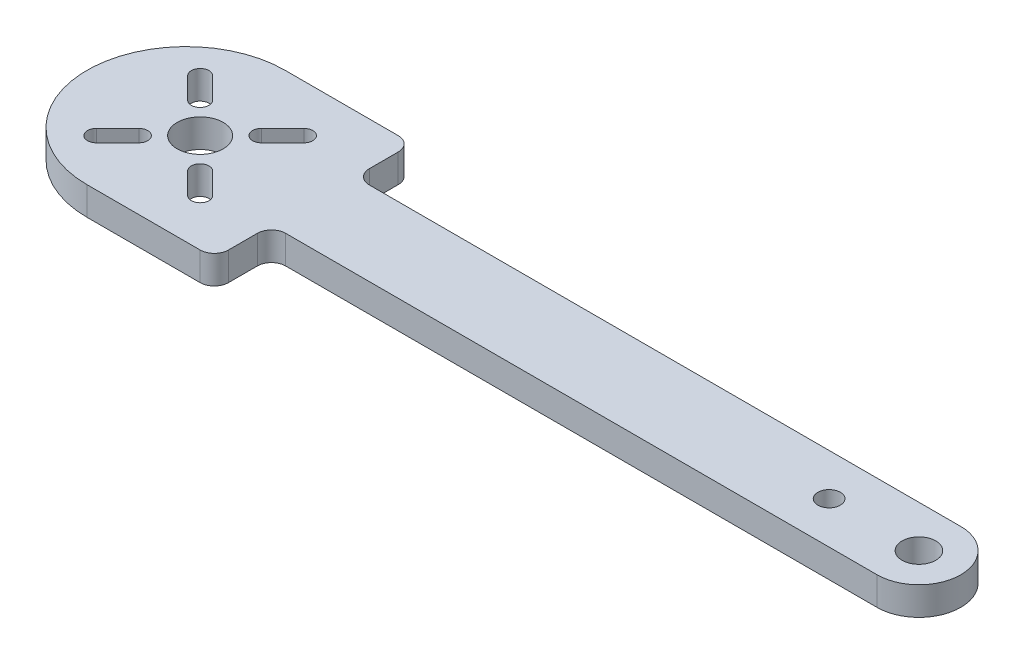
ISO-10303-21;
HEADER;
FILE_DESCRIPTION(('STEP AP214'),'2;1');
FILE_NAME('part.step','',(''),(''),'','','');
FILE_SCHEMA(('AUTOMOTIVE_DESIGN { 1 0 10303 214 1 1 1 1 }'));
ENDSEC;
DATA;
#1=APPLICATION_CONTEXT('core data for automotive mechanical design processes');
#2=APPLICATION_PROTOCOL_DEFINITION('international standard','automotive_design',2000,#1);
#3=PRODUCT_CONTEXT('',#1,'mechanical');
#4=PRODUCT('Part','Part','',(#3));
#5=PRODUCT_RELATED_PRODUCT_CATEGORY('part','',(#4));
#6=PRODUCT_DEFINITION_FORMATION('','',#4);
#7=PRODUCT_DEFINITION_CONTEXT('part definition',#1,'design');
#8=PRODUCT_DEFINITION('design','',#6,#7);
#9=PRODUCT_DEFINITION_SHAPE('','',#8);
#10=(LENGTH_UNIT() NAMED_UNIT(*) SI_UNIT(.MILLI.,.METRE.));
#11=(NAMED_UNIT(*) PLANE_ANGLE_UNIT() SI_UNIT($,.RADIAN.));
#12=(NAMED_UNIT(*) SI_UNIT($,.STERADIAN.) SOLID_ANGLE_UNIT());
#13=UNCERTAINTY_MEASURE_WITH_UNIT(LENGTH_MEASURE(1.E-05),#10,'distance_accuracy_value','');
#14=(GEOMETRIC_REPRESENTATION_CONTEXT(3) GLOBAL_UNCERTAINTY_ASSIGNED_CONTEXT((#13)) GLOBAL_UNIT_ASSIGNED_CONTEXT((#10,
#11,#12)) REPRESENTATION_CONTEXT('',''));
#15=CARTESIAN_POINT('',(0.,0.,0.));
#16=DIRECTION('',(0.,0.,1.));
#17=DIRECTION('',(1.,0.,0.));
#18=AXIS2_PLACEMENT_3D('',#15,#16,#17);
#19=CARTESIAN_POINT('',(-52.8000000000024,4.,2.25603595554234E-11));
#20=DIRECTION('',(0.,-1.,0.));
#21=DIRECTION('',(0.,0.,-1.));
#22=AXIS2_PLACEMENT_3D('',#19,#20,#21);
#23=PLANE('',#22);
#24=CARTESIAN_POINT('',(38.0999999999981,4.,7.24524850582999E-12));
#25=DIRECTION('',(0.,-1.,0.));
#26=DIRECTION('',(0.,0.,-1.));
#27=AXIS2_PLACEMENT_3D('',#24,#25,#26);
#28=CIRCLE('',#27,1.5875);
#29=CARTESIAN_POINT('',(38.0999999999981,4.,-1.58749999999275));
#30=VERTEX_POINT('',#29);
#31=EDGE_CURVE('E258',#30,#30,#28,.T.);
#32=ORIENTED_EDGE('',*,*,#31,.T.);
#33=EDGE_LOOP('',(#32));
#34=FACE_BOUND('',#33,.T.);
#35=CARTESIAN_POINT('',(-43.4637671451919,4.,7.3362328548329));
#36=DIRECTION('',(0.,1.,0.));
#37=DIRECTION('',(0.,0.,1.));
#38=AXIS2_PLACEMENT_3D('',#35,#36,#37);
#39=CIRCLE('',#38,1.25000000000001);
#40=CARTESIAN_POINT('',(-44.347650621675,4.,8.22011633131609));
#41=VERTEX_POINT('',#40);
#42=CARTESIAN_POINT('',(-42.5798836687087,4.,6.45234937834969));
#43=VERTEX_POINT('',#42);
#44=EDGE_CURVE('E274',#41,#43,#39,.T.);
#45=ORIENTED_EDGE('',*,*,#44,.F.);
#46=DIRECTION('',(0.707106781186556,0.,0.707106781186539));
#47=VECTOR('',#46,1.);
#48=CARTESIAN_POINT('',(-44.347650621675,4.,8.22011633131609));
#49=LINE('',#48,#47);
#50=CARTESIAN_POINT('',(-47.3528544417179,4.,5.21491251127332));
#51=VERTEX_POINT('',#50);
#52=EDGE_CURVE('E285',#51,#41,#49,.T.);
#53=ORIENTED_EDGE('',*,*,#52,.F.);
#54=CARTESIAN_POINT('',(-46.4689709652347,4.,4.33102903479012));
#55=DIRECTION('',(0.,1.,0.));
#56=DIRECTION('',(0.,0.,1.));
#57=AXIS2_PLACEMENT_3D('',#54,#55,#56);
#58=CIRCLE('',#57,1.25);
#59=CARTESIAN_POINT('',(-45.5850874887515,4.,3.44714555830693));
#60=VERTEX_POINT('',#59);
#61=EDGE_CURVE('E281',#60,#51,#58,.T.);
#62=ORIENTED_EDGE('',*,*,#61,.F.);
#63=DIRECTION('',(-0.707106781186558,0.,-0.707106781186537));
#64=VECTOR('',#63,1.);
#65=CARTESIAN_POINT('',(-42.5798836687087,4.,6.45234937834969));
#66=LINE('',#65,#64);
#67=EDGE_CURVE('E277',#43,#60,#66,.T.);
#68=ORIENTED_EDGE('',*,*,#67,.F.);
#69=EDGE_LOOP('',(#45,#53,#62,#68));
#70=FACE_BOUND('',#69,.T.);
#71=CARTESIAN_POINT('',(50.7999999999981,4.,2.25602370907435E-11));
#72=DIRECTION('',(0.,1.,0.));
#73=DIRECTION('',(0.,0.,1.));
#74=AXIS2_PLACEMENT_3D('',#71,#72,#73);
#75=CIRCLE('',#74,2.38125000000842);
#76=CARTESIAN_POINT('',(50.7999999999981,4.,2.38125000003099));
#77=VERTEX_POINT('',#76);
#78=EDGE_CURVE('E360',#77,#77,#75,.T.);
#79=ORIENTED_EDGE('',*,*,#78,.F.);
#80=EDGE_LOOP('',(#79));
#81=FACE_BOUND('',#80,.T.);
#82=CARTESIAN_POINT('',(-58.1362328548129,4.,-7.33623285478778));
#83=DIRECTION('',(0.,1.,0.));
#84=DIRECTION('',(0.,0.,1.));
#85=AXIS2_PLACEMENT_3D('',#82,#83,#84);
#86=CIRCLE('',#85,1.25);
#87=CARTESIAN_POINT('',(-57.2523493783297,4.,-8.22011633127098));
#88=VERTEX_POINT('',#87);
#89=CARTESIAN_POINT('',(-59.0201163312961,4.,-6.45234937830458));
#90=VERTEX_POINT('',#89);
#91=EDGE_CURVE('E368',#88,#90,#86,.T.);
#92=ORIENTED_EDGE('',*,*,#91,.F.);
#93=DIRECTION('',(-0.707106781186557,0.,-0.707106781186539));
#94=VECTOR('',#93,1.);
#95=CARTESIAN_POINT('',(-57.2523493783297,4.,-8.22011633127098));
#96=LINE('',#95,#94);
#97=CARTESIAN_POINT('',(-54.2471455582869,4.,-5.21491251122819));
#98=VERTEX_POINT('',#97);
#99=EDGE_CURVE('E379',#98,#88,#96,.T.);
#100=ORIENTED_EDGE('',*,*,#99,.F.);
#101=CARTESIAN_POINT('',(-55.13102903477,4.,-4.331029034745));
#102=DIRECTION('',(0.,1.,0.));
#103=DIRECTION('',(0.,0.,1.));
#104=AXIS2_PLACEMENT_3D('',#101,#102,#103);
#105=CIRCLE('',#104,1.25);
#106=CARTESIAN_POINT('',(-56.0149125112532,4.,-3.4471455582618));
#107=VERTEX_POINT('',#106);
#108=EDGE_CURVE('E375',#107,#98,#105,.T.);
#109=ORIENTED_EDGE('',*,*,#108,.F.);
#110=DIRECTION('',(0.707106781186557,0.,0.707106781186538));
#111=VECTOR('',#110,1.);
#112=CARTESIAN_POINT('',(-59.0201163312961,4.,-6.45234937830458));
#113=LINE('',#112,#111);
#114=EDGE_CURVE('E371',#90,#107,#113,.T.);
#115=ORIENTED_EDGE('',*,*,#114,.F.);
#116=EDGE_LOOP('',(#92,#100,#109,#115));
#117=FACE_BOUND('',#116,.T.);
#118=CARTESIAN_POINT('',(-52.8000000000024,4.,2.25603595554234E-11));
#119=DIRECTION('',(0.,1.,0.));
#120=DIRECTION('',(0.,0.,-1.));
#121=AXIS2_PLACEMENT_3D('',#118,#119,#120);
#122=CIRCLE('',#121,14.);
#123=CARTESIAN_POINT('',(-52.8000000000024,4.,-13.9999999999787));
#124=VERTEX_POINT('',#123);
#125=CARTESIAN_POINT('',(-52.8000000000024,4.,14.0000000000213));
#126=VERTEX_POINT('',#125);
#127=EDGE_CURVE('E419',#124,#126,#122,.T.);
#128=ORIENTED_EDGE('',*,*,#127,.T.);
#129=DIRECTION('',(1.,0.,3.04443970033929E-13));
#130=VECTOR('',#129,1.);
#131=CARTESIAN_POINT('',(-50.8000000000024,4.,14.000000000022));
#132=LINE('',#131,#130);
#133=CARTESIAN_POINT('',(-36.8000000000024,4.,14.000000000022));
#134=VERTEX_POINT('',#133);
#135=EDGE_CURVE('E423',#126,#134,#132,.T.);
#136=ORIENTED_EDGE('',*,*,#135,.T.);
#137=CARTESIAN_POINT('',(-36.8000000000024,4.,12.000000000022));
#138=DIRECTION('',(0.,1.,0.));
#139=DIRECTION('',(0.,0.,1.));
#140=AXIS2_PLACEMENT_3D('',#137,#138,#139);
#141=CIRCLE('',#140,2.);
#142=CARTESIAN_POINT('',(-34.8000000000024,4.,12.000000000022));
#143=VERTEX_POINT('',#142);
#144=EDGE_CURVE('E427',#134,#143,#141,.T.);
#145=ORIENTED_EDGE('',*,*,#144,.T.);
#146=DIRECTION('',(0.,0.,-1.));
#147=VECTOR('',#146,1.);
#148=CARTESIAN_POINT('',(-34.8000000000024,4.,12.000000000022));
#149=LINE('',#148,#147);
#150=CARTESIAN_POINT('',(-34.8000000000024,4.,7.91455615182499));
#151=VERTEX_POINT('',#150);
#152=EDGE_CURVE('E430',#143,#151,#149,.T.);
#153=ORIENTED_EDGE('',*,*,#152,.T.);
#154=CARTESIAN_POINT('',(-32.8000000000024,4.,7.91455615182499));
#155=DIRECTION('',(0.,-1.,0.));
#156=DIRECTION('',(0.,0.,-1.));
#157=AXIS2_PLACEMENT_3D('',#154,#155,#156);
#158=CIRCLE('',#157,2.);
#159=CARTESIAN_POINT('',(-32.8000000000024,4.,5.91455615182499));
#160=VERTEX_POINT('',#159);
#161=EDGE_CURVE('E433',#151,#160,#158,.T.);
#162=ORIENTED_EDGE('',*,*,#161,.T.);
#163=DIRECTION('',(1.,0.,0.));
#164=VECTOR('',#163,1.);
#165=CARTESIAN_POINT('',(-32.8000000000024,4.,5.91455615182499));
#166=LINE('',#165,#164);
#167=CARTESIAN_POINT('',(50.7999999999981,4.,5.91455615182621));
#168=VERTEX_POINT('',#167);
#169=EDGE_CURVE('E436',#160,#168,#166,.T.);
#170=ORIENTED_EDGE('',*,*,#169,.T.);
#171=CARTESIAN_POINT('',(50.7999999999981,4.,2.25602370907435E-11));
#172=DIRECTION('',(0.,1.,0.));
#173=DIRECTION('',(0.,0.,-1.));
#174=AXIS2_PLACEMENT_3D('',#171,#172,#173);
#175=CIRCLE('',#174,5.91455615180365);
#176=CARTESIAN_POINT('',(50.7999999999981,4.,-5.91455615178231));
#177=VERTEX_POINT('',#176);
#178=EDGE_CURVE('E439',#168,#177,#175,.T.);
#179=ORIENTED_EDGE('',*,*,#178,.T.);
#180=DIRECTION('',(-1.,0.,0.));
#181=VECTOR('',#180,1.);
#182=CARTESIAN_POINT('',(-32.8000000000024,4.,-5.9145561517817));
#183=LINE('',#182,#181);
#184=CARTESIAN_POINT('',(-32.8000000000024,4.,-5.9145561517817));
#185=VERTEX_POINT('',#184);
#186=EDGE_CURVE('E442',#177,#185,#183,.T.);
#187=ORIENTED_EDGE('',*,*,#186,.T.);
#188=CARTESIAN_POINT('',(-32.8000000000024,4.,-7.9145561517817));
#189=DIRECTION('',(0.,-1.,0.));
#190=DIRECTION('',(0.,0.,-1.));
#191=AXIS2_PLACEMENT_3D('',#188,#189,#190);
#192=CIRCLE('',#191,2.);
#193=CARTESIAN_POINT('',(-34.8000000000024,4.,-7.9145561517817));
#194=VERTEX_POINT('',#193);
#195=EDGE_CURVE('E445',#185,#194,#192,.T.);
#196=ORIENTED_EDGE('',*,*,#195,.T.);
#197=DIRECTION('',(0.,0.,-1.));
#198=VECTOR('',#197,1.);
#199=CARTESIAN_POINT('',(-34.8000000000024,4.,-7.9145561517817));
#200=LINE('',#199,#198);
#201=CARTESIAN_POINT('',(-34.8000000000024,4.,-11.9999999999781));
#202=VERTEX_POINT('',#201);
#203=EDGE_CURVE('E448',#194,#202,#200,.T.);
#204=ORIENTED_EDGE('',*,*,#203,.T.);
#205=CARTESIAN_POINT('',(-36.8000000000024,4.,-11.9999999999781));
#206=DIRECTION('',(0.,1.,0.));
#207=DIRECTION('',(0.,0.,1.));
#208=AXIS2_PLACEMENT_3D('',#205,#206,#207);
#209=CIRCLE('',#208,2.);
#210=CARTESIAN_POINT('',(-36.8000000000024,4.,-13.9999999999781));
#211=VERTEX_POINT('',#210);
#212=EDGE_CURVE('E451',#202,#211,#209,.T.);
#213=ORIENTED_EDGE('',*,*,#212,.T.);
#214=DIRECTION('',(-1.,0.,0.));
#215=VECTOR('',#214,1.);
#216=CARTESIAN_POINT('',(-50.8000000000024,4.,-13.9999999999781));
#217=LINE('',#216,#215);
#218=EDGE_CURVE('E454',#211,#124,#217,.T.);
#219=ORIENTED_EDGE('',*,*,#218,.T.);
#220=EDGE_LOOP('',(#128,#136,#145,#153,#162,#170,#179,#187,#196,#204,#213,#219));
#221=FACE_BOUND('',#220,.T.);
#222=CARTESIAN_POINT('',(-50.8000000000024,4.,2.25602370907435E-11));
#223=DIRECTION('',(0.,1.,0.));
#224=DIRECTION('',(0.,0.,1.));
#225=AXIS2_PLACEMENT_3D('',#222,#223,#224);
#226=CIRCLE('',#225,3.25000000000889);
#227=CARTESIAN_POINT('',(-50.8000000000024,4.,3.25000000003145));
#228=VERTEX_POINT('',#227);
#229=EDGE_CURVE('E411',#228,#228,#226,.T.);
#230=ORIENTED_EDGE('',*,*,#229,.F.);
#231=EDGE_LOOP('',(#230));
#232=FACE_BOUND('',#231,.T.);
#233=CARTESIAN_POINT('',(-43.463767145192,4.,-7.33623285478795));
#234=DIRECTION('',(0.,1.,0.));
#235=DIRECTION('',(0.,0.,1.));
#236=AXIS2_PLACEMENT_3D('',#233,#234,#235);
#237=CIRCLE('',#236,1.25000000000001);
#238=CARTESIAN_POINT('',(-42.5798836687089,4.,-6.45234937830478));
#239=VERTEX_POINT('',#238);
#240=CARTESIAN_POINT('',(-44.3476506216753,4.,-8.22011633127114));
#241=VERTEX_POINT('',#240);
#242=EDGE_CURVE('E317',#239,#241,#237,.T.);
#243=ORIENTED_EDGE('',*,*,#242,.F.);
#244=DIRECTION('',(0.707106781186538,0.,-0.707106781186557));
#245=VECTOR('',#244,1.);
#246=CARTESIAN_POINT('',(-42.5798836687089,4.,-6.45234937830478));
#247=LINE('',#246,#245);
#248=CARTESIAN_POINT('',(-45.5850874887516,4.,-3.44714555826193));
#249=VERTEX_POINT('',#248);
#250=EDGE_CURVE('E328',#249,#239,#247,.T.);
#251=ORIENTED_EDGE('',*,*,#250,.F.);
#252=CARTESIAN_POINT('',(-46.4689709652348,4.,-4.3310290347451));
#253=DIRECTION('',(0.,1.,0.));
#254=DIRECTION('',(0.,0.,1.));
#255=AXIS2_PLACEMENT_3D('',#252,#253,#254);
#256=CIRCLE('',#255,1.25000000000001);
#257=CARTESIAN_POINT('',(-47.352854441718,4.,-5.21491251122828));
#258=VERTEX_POINT('',#257);
#259=EDGE_CURVE('E324',#258,#249,#256,.T.);
#260=ORIENTED_EDGE('',*,*,#259,.F.);
#261=DIRECTION('',(-0.707106781186539,0.,0.707106781186556));
#262=VECTOR('',#261,1.);
#263=CARTESIAN_POINT('',(-44.3476506216753,4.,-8.22011633127114));
#264=LINE('',#263,#262);
#265=EDGE_CURVE('E320',#241,#258,#264,.T.);
#266=ORIENTED_EDGE('',*,*,#265,.F.);
#267=EDGE_LOOP('',(#243,#251,#260,#266));
#268=FACE_BOUND('',#267,.T.);
#269=CARTESIAN_POINT('',(-58.1362328548127,4.,7.33623285483307));
#270=DIRECTION('',(0.,1.,0.));
#271=DIRECTION('',(0.,0.,1.));
#272=AXIS2_PLACEMENT_3D('',#269,#270,#271);
#273=CIRCLE('',#272,1.25000000000002);
#274=CARTESIAN_POINT('',(-59.0201163312959,4.,6.4523493783499));
#275=VERTEX_POINT('',#274);
#276=CARTESIAN_POINT('',(-57.2523493783295,4.,8.22011633131627));
#277=VERTEX_POINT('',#276);
#278=EDGE_CURVE('E224',#275,#277,#273,.T.);
#279=ORIENTED_EDGE('',*,*,#278,.F.);
#280=DIRECTION('',(-0.707106781186539,0.,0.707106781186556));
#281=VECTOR('',#280,1.);
#282=CARTESIAN_POINT('',(-59.0201163312959,4.,6.4523493783499));
#283=LINE('',#282,#281);
#284=CARTESIAN_POINT('',(-56.0149125112531,4.,3.44714555830706));
#285=VERTEX_POINT('',#284);
#286=EDGE_CURVE('E250',#285,#275,#283,.T.);
#287=ORIENTED_EDGE('',*,*,#286,.F.);
#288=CARTESIAN_POINT('',(-55.13102903477,4.,4.33102903479022));
#289=DIRECTION('',(0.,1.,0.));
#290=DIRECTION('',(0.,0.,1.));
#291=AXIS2_PLACEMENT_3D('',#288,#289,#290);
#292=CIRCLE('',#291,1.25000000000002);
#293=CARTESIAN_POINT('',(-54.2471455582867,4.,5.2149125112734));
#294=VERTEX_POINT('',#293);
#295=EDGE_CURVE('E246',#294,#285,#292,.T.);
#296=ORIENTED_EDGE('',*,*,#295,.F.);
#297=DIRECTION('',(0.707106781186539,0.,-0.707106781186556));
#298=VECTOR('',#297,1.);
#299=CARTESIAN_POINT('',(-57.2523493783295,4.,8.22011633131627));
#300=LINE('',#299,#298);
#301=EDGE_CURVE('E233',#277,#294,#300,.T.);
#302=ORIENTED_EDGE('',*,*,#301,.F.);
#303=EDGE_LOOP('',(#279,#287,#296,#302));
#304=FACE_BOUND('',#303,.T.);
#305=ADVANCED_FACE('F38',(#34,#70,#81,#117,#221,#232,#268,#304),#23,.F.);
#306=CARTESIAN_POINT('',(-52.8000000000024,0.,2.25603595554234E-11));
#307=DIRECTION('',(0.,-1.,0.));
#308=DIRECTION('',(0.,0.,-1.));
#309=AXIS2_PLACEMENT_3D('',#306,#307,#308);
#310=PLANE('',#309);
#311=CARTESIAN_POINT('',(38.0999999999981,0.,7.24524850582999E-12));
#312=DIRECTION('',(0.,-1.,0.));
#313=DIRECTION('',(0.,0.,-1.));
#314=AXIS2_PLACEMENT_3D('',#311,#312,#313);
#315=CIRCLE('',#314,1.5875);
#316=CARTESIAN_POINT('',(38.0999999999981,0.,-1.58749999999275));
#317=VERTEX_POINT('',#316);
#318=EDGE_CURVE('E903',#317,#317,#315,.T.);
#319=ORIENTED_EDGE('',*,*,#318,.F.);
#320=EDGE_LOOP('',(#319));
#321=FACE_BOUND('',#320,.T.);
#322=DIRECTION('',(-0.707106781186557,0.,-0.707106781186539));
#323=VECTOR('',#322,1.);
#324=CARTESIAN_POINT('',(-57.2523493783297,0.,-8.22011633127098));
#325=LINE('',#324,#323);
#326=CARTESIAN_POINT('',(-54.2471455582869,0.,-5.21491251122819));
#327=VERTEX_POINT('',#326);
#328=CARTESIAN_POINT('',(-57.2523493783297,0.,-8.22011633127097));
#329=VERTEX_POINT('',#328);
#330=EDGE_CURVE('E372',#327,#329,#325,.T.);
#331=ORIENTED_EDGE('',*,*,#330,.T.);
#332=CARTESIAN_POINT('',(-58.1362328548129,0.,-7.33623285478778));
#333=DIRECTION('',(0.,1.,0.));
#334=DIRECTION('',(0.,0.,1.));
#335=AXIS2_PLACEMENT_3D('',#332,#333,#334);
#336=CIRCLE('',#335,1.25);
#337=CARTESIAN_POINT('',(-59.0201163312961,0.,-6.45234937830458));
#338=VERTEX_POINT('',#337);
#339=EDGE_CURVE('E364',#329,#338,#336,.T.);
#340=ORIENTED_EDGE('',*,*,#339,.T.);
#341=DIRECTION('',(0.707106781186557,0.,0.707106781186538));
#342=VECTOR('',#341,1.);
#343=CARTESIAN_POINT('',(-59.0201163312961,0.,-6.45234937830458));
#344=LINE('',#343,#342);
#345=CARTESIAN_POINT('',(-56.0149125112532,0.,-3.4471455582618));
#346=VERTEX_POINT('',#345);
#347=EDGE_CURVE('E386',#338,#346,#344,.T.);
#348=ORIENTED_EDGE('',*,*,#347,.T.);
#349=CARTESIAN_POINT('',(-55.13102903477,0.,-4.331029034745));
#350=DIRECTION('',(0.,1.,0.));
#351=DIRECTION('',(0.,0.,1.));
#352=AXIS2_PLACEMENT_3D('',#349,#350,#351);
#353=CIRCLE('',#352,1.25);
#354=EDGE_CURVE('E390',#346,#327,#353,.T.);
#355=ORIENTED_EDGE('',*,*,#354,.T.);
#356=EDGE_LOOP('',(#331,#340,#348,#355));
#357=FACE_BOUND('',#356,.T.);
#358=CARTESIAN_POINT('',(-50.8000000000024,0.,2.25602370907435E-11));
#359=DIRECTION('',(0.,1.,0.));
#360=DIRECTION('',(0.,0.,1.));
#361=AXIS2_PLACEMENT_3D('',#358,#359,#360);
#362=CIRCLE('',#361,3.25000000000889);
#363=CARTESIAN_POINT('',(-50.8000000000024,0.,3.25000000003145));
#364=VERTEX_POINT('',#363);
#365=EDGE_CURVE('E410',#364,#364,#362,.T.);
#366=ORIENTED_EDGE('',*,*,#365,.T.);
#367=EDGE_LOOP('',(#366));
#368=FACE_BOUND('',#367,.T.);
#369=CARTESIAN_POINT('',(-52.8000000000024,0.,2.25603595554234E-11));
#370=DIRECTION('',(0.,1.,0.));
#371=DIRECTION('',(0.,0.,-1.));
#372=AXIS2_PLACEMENT_3D('',#369,#370,#371);
#373=CIRCLE('',#372,14.);
#374=CARTESIAN_POINT('',(-52.8000000000024,0.,-13.9999999999787));
#375=VERTEX_POINT('',#374);
#376=CARTESIAN_POINT('',(-52.8000000000024,0.,14.0000000000213));
#377=VERTEX_POINT('',#376);
#378=EDGE_CURVE('E415',#375,#377,#373,.T.);
#379=ORIENTED_EDGE('',*,*,#378,.F.);
#380=DIRECTION('',(-1.,0.,-3.04443970033929E-13));
#381=VECTOR('',#380,1.);
#382=CARTESIAN_POINT('',(-50.8000000000024,0.,-13.9999999999781));
#383=LINE('',#382,#381);
#384=CARTESIAN_POINT('',(-36.8000000000024,0.,-13.9999999999781));
#385=VERTEX_POINT('',#384);
#386=EDGE_CURVE('E424',#385,#375,#383,.T.);
#387=ORIENTED_EDGE('',*,*,#386,.F.);
#388=CARTESIAN_POINT('',(-36.8000000000024,0.,-11.9999999999781));
#389=DIRECTION('',(0.,1.,0.));
#390=DIRECTION('',(0.,0.,1.));
#391=AXIS2_PLACEMENT_3D('',#388,#389,#390);
#392=CIRCLE('',#391,2.);
#393=CARTESIAN_POINT('',(-34.8000000000024,0.,-11.9999999999781));
#394=VERTEX_POINT('',#393);
#395=EDGE_CURVE('E488',#394,#385,#392,.T.);
#396=ORIENTED_EDGE('',*,*,#395,.F.);
#397=DIRECTION('',(0.,0.,-1.));
#398=VECTOR('',#397,1.);
#399=CARTESIAN_POINT('',(-34.8000000000024,0.,-7.9145561517817));
#400=LINE('',#399,#398);
#401=CARTESIAN_POINT('',(-34.8000000000024,0.,-7.9145561517817));
#402=VERTEX_POINT('',#401);
#403=EDGE_CURVE('E485',#402,#394,#400,.T.);
#404=ORIENTED_EDGE('',*,*,#403,.F.);
#405=CARTESIAN_POINT('',(-32.8000000000024,0.,-7.9145561517817));
#406=DIRECTION('',(0.,-1.,0.));
#407=DIRECTION('',(0.,0.,-1.));
#408=AXIS2_PLACEMENT_3D('',#405,#406,#407);
#409=CIRCLE('',#408,2.);
#410=CARTESIAN_POINT('',(-32.8000000000024,0.,-5.9145561517817));
#411=VERTEX_POINT('',#410);
#412=EDGE_CURVE('E482',#411,#402,#409,.T.);
#413=ORIENTED_EDGE('',*,*,#412,.F.);
#414=DIRECTION('',(-1.,0.,0.));
#415=VECTOR('',#414,1.);
#416=CARTESIAN_POINT('',(-32.8000000000024,0.,-5.9145561517817));
#417=LINE('',#416,#415);
#418=CARTESIAN_POINT('',(50.7999999999981,0.,-5.91455615178231));
#419=VERTEX_POINT('',#418);
#420=EDGE_CURVE('E479',#419,#411,#417,.T.);
#421=ORIENTED_EDGE('',*,*,#420,.F.);
#422=CARTESIAN_POINT('',(50.7999999999981,0.,2.25602370907435E-11));
#423=DIRECTION('',(0.,1.,0.));
#424=DIRECTION('',(0.,0.,-1.));
#425=AXIS2_PLACEMENT_3D('',#422,#423,#424);
#426=CIRCLE('',#425,5.91455615180365);
#427=CARTESIAN_POINT('',(50.7999999999981,0.,5.91455615182621));
#428=VERTEX_POINT('',#427);
#429=EDGE_CURVE('E476',#428,#419,#426,.T.);
#430=ORIENTED_EDGE('',*,*,#429,.F.);
#431=DIRECTION('',(1.,0.,0.));
#432=VECTOR('',#431,1.);
#433=CARTESIAN_POINT('',(-32.8000000000024,0.,5.91455615182499));
#434=LINE('',#433,#432);
#435=CARTESIAN_POINT('',(-32.8000000000024,0.,5.91455615182499));
#436=VERTEX_POINT('',#435);
#437=EDGE_CURVE('E473',#436,#428,#434,.T.);
#438=ORIENTED_EDGE('',*,*,#437,.F.);
#439=CARTESIAN_POINT('',(-32.8000000000024,0.,7.91455615182499));
#440=DIRECTION('',(0.,-1.,0.));
#441=DIRECTION('',(0.,0.,-1.));
#442=AXIS2_PLACEMENT_3D('',#439,#440,#441);
#443=CIRCLE('',#442,2.);
#444=CARTESIAN_POINT('',(-34.8000000000024,0.,7.91455615182499));
#445=VERTEX_POINT('',#444);
#446=EDGE_CURVE('E470',#445,#436,#443,.T.);
#447=ORIENTED_EDGE('',*,*,#446,.F.);
#448=DIRECTION('',(0.,0.,-1.));
#449=VECTOR('',#448,1.);
#450=CARTESIAN_POINT('',(-34.8000000000024,0.,12.000000000022));
#451=LINE('',#450,#449);
#452=CARTESIAN_POINT('',(-34.8000000000024,0.,12.000000000022));
#453=VERTEX_POINT('',#452);
#454=EDGE_CURVE('E467',#453,#445,#451,.T.);
#455=ORIENTED_EDGE('',*,*,#454,.F.);
#456=CARTESIAN_POINT('',(-36.8000000000024,0.,12.000000000022));
#457=DIRECTION('',(0.,1.,0.));
#458=DIRECTION('',(0.,0.,1.));
#459=AXIS2_PLACEMENT_3D('',#456,#457,#458);
#460=CIRCLE('',#459,2.);
#461=CARTESIAN_POINT('',(-36.8000000000024,0.,14.000000000022));
#462=VERTEX_POINT('',#461);
#463=EDGE_CURVE('E464',#462,#453,#460,.T.);
#464=ORIENTED_EDGE('',*,*,#463,.F.);
#465=DIRECTION('',(1.,0.,0.));
#466=VECTOR('',#465,1.);
#467=CARTESIAN_POINT('',(-50.8000000000024,0.,14.000000000022));
#468=LINE('',#467,#466);
#469=EDGE_CURVE('E461',#377,#462,#468,.T.);
#470=ORIENTED_EDGE('',*,*,#469,.F.);
#471=EDGE_LOOP('',(#379,#387,#396,#404,#413,#421,#430,#438,#447,#455,#464,#470));
#472=FACE_BOUND('',#471,.T.);
#473=CARTESIAN_POINT('',(50.7999999999981,0.,2.25602370907435E-11));
#474=DIRECTION('',(0.,1.,0.));
#475=DIRECTION('',(0.,0.,1.));
#476=AXIS2_PLACEMENT_3D('',#473,#474,#475);
#477=CIRCLE('',#476,2.38125000000842);
#478=CARTESIAN_POINT('',(50.7999999999981,0.,2.38125000003099));
#479=VERTEX_POINT('',#478);
#480=EDGE_CURVE('E359',#479,#479,#477,.T.);
#481=ORIENTED_EDGE('',*,*,#480,.T.);
#482=EDGE_LOOP('',(#481));
#483=FACE_BOUND('',#482,.T.);
#484=DIRECTION('',(0.707106781186538,0.,-0.707106781186557));
#485=VECTOR('',#484,1.);
#486=CARTESIAN_POINT('',(-42.5798836687089,0.,-6.45234937830478));
#487=LINE('',#486,#485);
#488=CARTESIAN_POINT('',(-45.5850874887516,0.,-3.44714555826193));
#489=VERTEX_POINT('',#488);
#490=CARTESIAN_POINT('',(-42.5798836687089,0.,-6.45234937830478));
#491=VERTEX_POINT('',#490);
#492=EDGE_CURVE('E321',#489,#491,#487,.T.);
#493=ORIENTED_EDGE('',*,*,#492,.T.);
#494=CARTESIAN_POINT('',(-43.463767145192,0.,-7.33623285478795));
#495=DIRECTION('',(0.,1.,0.));
#496=DIRECTION('',(0.,0.,1.));
#497=AXIS2_PLACEMENT_3D('',#494,#495,#496);
#498=CIRCLE('',#497,1.25000000000001);
#499=CARTESIAN_POINT('',(-44.3476506216753,0.,-8.22011633127114));
#500=VERTEX_POINT('',#499);
#501=EDGE_CURVE('E316',#491,#500,#498,.T.);
#502=ORIENTED_EDGE('',*,*,#501,.T.);
#503=DIRECTION('',(-0.707106781186539,0.,0.707106781186556));
#504=VECTOR('',#503,1.);
#505=CARTESIAN_POINT('',(-44.3476506216753,0.,-8.22011633127114));
#506=LINE('',#505,#504);
#507=CARTESIAN_POINT('',(-47.352854441718,0.,-5.21491251122828));
#508=VERTEX_POINT('',#507);
#509=EDGE_CURVE('E335',#500,#508,#506,.T.);
#510=ORIENTED_EDGE('',*,*,#509,.T.);
#511=CARTESIAN_POINT('',(-46.4689709652348,0.,-4.3310290347451));
#512=DIRECTION('',(0.,1.,0.));
#513=DIRECTION('',(0.,0.,1.));
#514=AXIS2_PLACEMENT_3D('',#511,#512,#513);
#515=CIRCLE('',#514,1.25000000000001);
#516=EDGE_CURVE('E339',#508,#489,#515,.T.);
#517=ORIENTED_EDGE('',*,*,#516,.T.);
#518=EDGE_LOOP('',(#493,#502,#510,#517));
#519=FACE_BOUND('',#518,.T.);
#520=DIRECTION('',(0.707106781186556,0.,0.707106781186539));
#521=VECTOR('',#520,1.);
#522=CARTESIAN_POINT('',(-44.347650621675,0.,8.22011633131609));
#523=LINE('',#522,#521);
#524=CARTESIAN_POINT('',(-47.3528544417179,0.,5.21491251127332));
#525=VERTEX_POINT('',#524);
#526=CARTESIAN_POINT('',(-44.347650621675,0.,8.22011633131609));
#527=VERTEX_POINT('',#526);
#528=EDGE_CURVE('E278',#525,#527,#523,.T.);
#529=ORIENTED_EDGE('',*,*,#528,.T.);
#530=CARTESIAN_POINT('',(-43.4637671451919,0.,7.3362328548329));
#531=DIRECTION('',(0.,1.,0.));
#532=DIRECTION('',(0.,0.,1.));
#533=AXIS2_PLACEMENT_3D('',#530,#531,#532);
#534=CIRCLE('',#533,1.25000000000001);
#535=CARTESIAN_POINT('',(-42.5798836687087,0.,6.45234937834969));
#536=VERTEX_POINT('',#535);
#537=EDGE_CURVE('E242',#527,#536,#534,.T.);
#538=ORIENTED_EDGE('',*,*,#537,.T.);
#539=DIRECTION('',(-0.707106781186558,0.,-0.707106781186537));
#540=VECTOR('',#539,1.);
#541=CARTESIAN_POINT('',(-42.5798836687087,0.,6.45234937834969));
#542=LINE('',#541,#540);
#543=CARTESIAN_POINT('',(-45.5850874887515,0.,3.44714555830693));
#544=VERTEX_POINT('',#543);
#545=EDGE_CURVE('E292',#536,#544,#542,.T.);
#546=ORIENTED_EDGE('',*,*,#545,.T.);
#547=CARTESIAN_POINT('',(-46.4689709652347,0.,4.33102903479012));
#548=DIRECTION('',(0.,1.,0.));
#549=DIRECTION('',(0.,0.,1.));
#550=AXIS2_PLACEMENT_3D('',#547,#548,#549);
#551=CIRCLE('',#550,1.25);
#552=EDGE_CURVE('E296',#544,#525,#551,.T.);
#553=ORIENTED_EDGE('',*,*,#552,.T.);
#554=EDGE_LOOP('',(#529,#538,#546,#553));
#555=FACE_BOUND('',#554,.T.);
#556=DIRECTION('',(-0.707106781186539,0.,0.707106781186556));
#557=VECTOR('',#556,1.);
#558=CARTESIAN_POINT('',(-59.0201163312959,0.,6.4523493783499));
#559=LINE('',#558,#557);
#560=CARTESIAN_POINT('',(-56.0149125112531,0.,3.44714555830706));
#561=VERTEX_POINT('',#560);
#562=CARTESIAN_POINT('',(-59.0201163312959,0.,6.4523493783499));
#563=VERTEX_POINT('',#562);
#564=EDGE_CURVE('E234',#561,#563,#559,.T.);
#565=ORIENTED_EDGE('',*,*,#564,.T.);
#566=CARTESIAN_POINT('',(-58.1362328548127,0.,7.33623285483307));
#567=DIRECTION('',(0.,1.,0.));
#568=DIRECTION('',(0.,0.,1.));
#569=AXIS2_PLACEMENT_3D('',#566,#567,#568);
#570=CIRCLE('',#569,1.25000000000002);
#571=CARTESIAN_POINT('',(-57.2523493783295,0.,8.22011633131627));
#572=VERTEX_POINT('',#571);
#573=EDGE_CURVE('E62',#563,#572,#570,.T.);
#574=ORIENTED_EDGE('',*,*,#573,.T.);
#575=DIRECTION('',(0.707106781186539,0.,-0.707106781186556));
#576=VECTOR('',#575,1.);
#577=CARTESIAN_POINT('',(-57.2523493783295,0.,8.22011633131627));
#578=LINE('',#577,#576);
#579=CARTESIAN_POINT('',(-54.2471455582867,0.,5.2149125112734));
#580=VERTEX_POINT('',#579);
#581=EDGE_CURVE('E240',#572,#580,#578,.T.);
#582=ORIENTED_EDGE('',*,*,#581,.T.);
#583=CARTESIAN_POINT('',(-55.13102903477,0.,4.33102903479022));
#584=DIRECTION('',(0.,1.,0.));
#585=DIRECTION('',(0.,0.,1.));
#586=AXIS2_PLACEMENT_3D('',#583,#584,#585);
#587=CIRCLE('',#586,1.25000000000002);
#588=EDGE_CURVE('E261',#580,#561,#587,.T.);
#589=ORIENTED_EDGE('',*,*,#588,.T.);
#590=EDGE_LOOP('',(#565,#574,#582,#589));
#591=FACE_BOUND('',#590,.T.);
#592=ADVANCED_FACE('F544',(#321,#357,#368,#472,#483,#519,#555,#591),#310,.T.);
#593=CARTESIAN_POINT('',(-52.8000000000024,4.,2.25603595554234E-11));
#594=DIRECTION('',(0.,-1.,0.));
#595=DIRECTION('',(0.,0.,-1.));
#596=AXIS2_PLACEMENT_3D('',#593,#594,#595);
#597=CYLINDRICAL_SURFACE('',#596,14.);
#598=ORIENTED_EDGE('',*,*,#378,.T.);
#599=DIRECTION('',(0.,-1.,0.));
#600=VECTOR('',#599,1.);
#601=CARTESIAN_POINT('',(-52.8000000000024,4.,14.0000000000213));
#602=LINE('',#601,#600);
#603=EDGE_CURVE('E11',#126,#377,#602,.T.);
#604=ORIENTED_EDGE('',*,*,#603,.F.);
#605=ORIENTED_EDGE('',*,*,#127,.F.);
#606=DIRECTION('',(0.,-1.,0.));
#607=VECTOR('',#606,1.);
#608=CARTESIAN_POINT('',(-52.8000000000024,4.,-13.9999999999787));
#609=LINE('',#608,#607);
#610=EDGE_CURVE('E457',#124,#375,#609,.T.);
#611=ORIENTED_EDGE('',*,*,#610,.T.);
#612=EDGE_LOOP('',(#598,#604,#605,#611));
#613=FACE_BOUND('',#612,.T.);
#614=ADVANCED_FACE('F40',(#613),#597,.T.);
#615=CARTESIAN_POINT('',(-50.8000000000024,4.,14.000000000022));
#616=DIRECTION('',(0.,0.,-1.));
#617=DIRECTION('',(-1.,0.,0.));
#618=AXIS2_PLACEMENT_3D('',#615,#616,#617);
#619=PLANE('',#618);
#620=ORIENTED_EDGE('',*,*,#469,.T.);
#621=DIRECTION('',(0.,-1.,0.));
#622=VECTOR('',#621,1.);
#623=CARTESIAN_POINT('',(-36.8000000000024,4.,14.000000000022));
#624=LINE('',#623,#622);
#625=EDGE_CURVE('E47',#134,#462,#624,.T.);
#626=ORIENTED_EDGE('',*,*,#625,.F.);
#627=ORIENTED_EDGE('',*,*,#135,.F.);
#628=ORIENTED_EDGE('',*,*,#603,.T.);
#629=EDGE_LOOP('',(#620,#626,#627,#628));
#630=FACE_BOUND('',#629,.T.);
#631=ADVANCED_FACE('F562',(#630),#619,.F.);
#632=CARTESIAN_POINT('',(-36.8000000000024,4.,12.000000000022));
#633=DIRECTION('',(0.,-1.,0.));
#634=DIRECTION('',(0.,0.,-1.));
#635=AXIS2_PLACEMENT_3D('',#632,#633,#634);
#636=CYLINDRICAL_SURFACE('',#635,2.);
#637=ORIENTED_EDGE('',*,*,#463,.T.);
#638=DIRECTION('',(0.,-1.,0.));
#639=VECTOR('',#638,1.);
#640=CARTESIAN_POINT('',(-34.8000000000024,4.,12.000000000022));
#641=LINE('',#640,#639);
#642=EDGE_CURVE('E529',#143,#453,#641,.T.);
#643=ORIENTED_EDGE('',*,*,#642,.F.);
#644=ORIENTED_EDGE('',*,*,#144,.F.);
#645=ORIENTED_EDGE('',*,*,#625,.T.);
#646=EDGE_LOOP('',(#637,#643,#644,#645));
#647=FACE_BOUND('',#646,.T.);
#648=ADVANCED_FACE('F538',(#647),#636,.T.);
#649=CARTESIAN_POINT('',(-34.8000000000024,4.,12.000000000022));
#650=DIRECTION('',(-1.,0.,0.));
#651=DIRECTION('',(0.,0.,1.));
#652=AXIS2_PLACEMENT_3D('',#649,#650,#651);
#653=PLANE('',#652);
#654=ORIENTED_EDGE('',*,*,#454,.T.);
#655=DIRECTION('',(0.,-1.,0.));
#656=VECTOR('',#655,1.);
#657=CARTESIAN_POINT('',(-34.8000000000024,4.,7.91455615182499));
#658=LINE('',#657,#656);
#659=EDGE_CURVE('E525',#151,#445,#658,.T.);
#660=ORIENTED_EDGE('',*,*,#659,.F.);
#661=ORIENTED_EDGE('',*,*,#152,.F.);
#662=ORIENTED_EDGE('',*,*,#642,.T.);
#663=EDGE_LOOP('',(#654,#660,#661,#662));
#664=FACE_BOUND('',#663,.T.);
#665=ADVANCED_FACE('F550',(#664),#653,.F.);
#666=CARTESIAN_POINT('',(-32.8000000000024,4.,7.91455615182499));
#667=DIRECTION('',(0.,-1.,0.));
#668=DIRECTION('',(0.,0.,-1.));
#669=AXIS2_PLACEMENT_3D('',#666,#667,#668);
#670=CYLINDRICAL_SURFACE('',#669,2.);
#671=ORIENTED_EDGE('',*,*,#446,.T.);
#672=DIRECTION('',(0.,-1.,0.));
#673=VECTOR('',#672,1.);
#674=CARTESIAN_POINT('',(-32.8000000000024,4.,5.91455615182499));
#675=LINE('',#674,#673);
#676=EDGE_CURVE('E521',#160,#436,#675,.T.);
#677=ORIENTED_EDGE('',*,*,#676,.F.);
#678=ORIENTED_EDGE('',*,*,#161,.F.);
#679=ORIENTED_EDGE('',*,*,#659,.T.);
#680=EDGE_LOOP('',(#671,#677,#678,#679));
#681=FACE_BOUND('',#680,.T.);
#682=ADVANCED_FACE('F554',(#681),#670,.F.);
#683=CARTESIAN_POINT('',(-32.8000000000024,4.,5.91455615182499));
#684=DIRECTION('',(0.,0.,-1.));
#685=DIRECTION('',(-1.,0.,0.));
#686=AXIS2_PLACEMENT_3D('',#683,#684,#685);
#687=PLANE('',#686);
#688=ORIENTED_EDGE('',*,*,#437,.T.);
#689=DIRECTION('',(0.,-1.,0.));
#690=VECTOR('',#689,1.);
#691=CARTESIAN_POINT('',(50.7999999999981,4.,5.91455615182621));
#692=LINE('',#691,#690);
#693=EDGE_CURVE('E517',#168,#428,#692,.T.);
#694=ORIENTED_EDGE('',*,*,#693,.F.);
#695=ORIENTED_EDGE('',*,*,#169,.F.);
#696=ORIENTED_EDGE('',*,*,#676,.T.);
#697=EDGE_LOOP('',(#688,#694,#695,#696));
#698=FACE_BOUND('',#697,.T.);
#699=ADVANCED_FACE('F594',(#698),#687,.F.);
#700=CARTESIAN_POINT('',(50.7999999999981,4.,2.25602370907435E-11));
#701=DIRECTION('',(0.,-1.,0.));
#702=DIRECTION('',(0.,0.,-1.));
#703=AXIS2_PLACEMENT_3D('',#700,#701,#702);
#704=CYLINDRICAL_SURFACE('',#703,5.91455615180365);
#705=ORIENTED_EDGE('',*,*,#429,.T.);
#706=DIRECTION('',(0.,-1.,0.));
#707=VECTOR('',#706,1.);
#708=CARTESIAN_POINT('',(50.7999999999981,4.,-5.91455615178231));
#709=LINE('',#708,#707);
#710=EDGE_CURVE('E513',#177,#419,#709,.T.);
#711=ORIENTED_EDGE('',*,*,#710,.F.);
#712=ORIENTED_EDGE('',*,*,#178,.F.);
#713=ORIENTED_EDGE('',*,*,#693,.T.);
#714=EDGE_LOOP('',(#705,#711,#712,#713));
#715=FACE_BOUND('',#714,.T.);
#716=ADVANCED_FACE('F592',(#715),#704,.T.);
#717=CARTESIAN_POINT('',(-32.8000000000024,4.,-5.9145561517817));
#718=DIRECTION('',(0.,0.,1.));
#719=DIRECTION('',(1.,0.,0.));
#720=AXIS2_PLACEMENT_3D('',#717,#718,#719);
#721=PLANE('',#720);
#722=ORIENTED_EDGE('',*,*,#420,.T.);
#723=DIRECTION('',(0.,-1.,0.));
#724=VECTOR('',#723,1.);
#725=CARTESIAN_POINT('',(-32.8000000000024,4.,-5.9145561517817));
#726=LINE('',#725,#724);
#727=EDGE_CURVE('E509',#185,#411,#726,.T.);
#728=ORIENTED_EDGE('',*,*,#727,.F.);
#729=ORIENTED_EDGE('',*,*,#186,.F.);
#730=ORIENTED_EDGE('',*,*,#710,.T.);
#731=EDGE_LOOP('',(#722,#728,#729,#730));
#732=FACE_BOUND('',#731,.T.);
#733=ADVANCED_FACE('F588',(#732),#721,.F.);
#734=CARTESIAN_POINT('',(-32.8000000000024,4.,-7.9145561517817));
#735=DIRECTION('',(0.,-1.,0.));
#736=DIRECTION('',(0.,0.,-1.));
#737=AXIS2_PLACEMENT_3D('',#734,#735,#736);
#738=CYLINDRICAL_SURFACE('',#737,2.);
#739=ORIENTED_EDGE('',*,*,#412,.T.);
#740=DIRECTION('',(0.,-1.,0.));
#741=VECTOR('',#740,1.);
#742=CARTESIAN_POINT('',(-34.8000000000024,4.,-7.9145561517817));
#743=LINE('',#742,#741);
#744=EDGE_CURVE('E505',#194,#402,#743,.T.);
#745=ORIENTED_EDGE('',*,*,#744,.F.);
#746=ORIENTED_EDGE('',*,*,#195,.F.);
#747=ORIENTED_EDGE('',*,*,#727,.T.);
#748=EDGE_LOOP('',(#739,#745,#746,#747));
#749=FACE_BOUND('',#748,.T.);
#750=ADVANCED_FACE('F584',(#749),#738,.F.);
#751=CARTESIAN_POINT('',(-34.8000000000024,4.,-7.9145561517817));
#752=DIRECTION('',(-1.,0.,0.));
#753=DIRECTION('',(0.,0.,1.));
#754=AXIS2_PLACEMENT_3D('',#751,#752,#753);
#755=PLANE('',#754);
#756=ORIENTED_EDGE('',*,*,#403,.T.);
#757=DIRECTION('',(0.,-1.,0.));
#758=VECTOR('',#757,1.);
#759=CARTESIAN_POINT('',(-34.8000000000024,4.,-11.9999999999781));
#760=LINE('',#759,#758);
#761=EDGE_CURVE('E501',#202,#394,#760,.T.);
#762=ORIENTED_EDGE('',*,*,#761,.F.);
#763=ORIENTED_EDGE('',*,*,#203,.F.);
#764=ORIENTED_EDGE('',*,*,#744,.T.);
#765=EDGE_LOOP('',(#756,#762,#763,#764));
#766=FACE_BOUND('',#765,.T.);
#767=ADVANCED_FACE('F579',(#766),#755,.F.);
#768=CARTESIAN_POINT('',(-36.8000000000024,4.,-11.9999999999781));
#769=DIRECTION('',(0.,-1.,0.));
#770=DIRECTION('',(0.,0.,-1.));
#771=AXIS2_PLACEMENT_3D('',#768,#769,#770);
#772=CYLINDRICAL_SURFACE('',#771,2.);
#773=ORIENTED_EDGE('',*,*,#395,.T.);
#774=DIRECTION('',(0.,-1.,0.));
#775=VECTOR('',#774,1.);
#776=CARTESIAN_POINT('',(-36.8000000000024,4.,-13.9999999999781));
#777=LINE('',#776,#775);
#778=EDGE_CURVE('E497',#211,#385,#777,.T.);
#779=ORIENTED_EDGE('',*,*,#778,.F.);
#780=ORIENTED_EDGE('',*,*,#212,.F.);
#781=ORIENTED_EDGE('',*,*,#761,.T.);
#782=EDGE_LOOP('',(#773,#779,#780,#781));
#783=FACE_BOUND('',#782,.T.);
#784=ADVANCED_FACE('F570',(#783),#772,.T.);
#785=CARTESIAN_POINT('',(-50.8000000000024,4.,-13.9999999999781));
#786=DIRECTION('',(-3.04443970033929E-13,0.,1.));
#787=DIRECTION('',(1.,0.,3.04443970033929E-13));
#788=AXIS2_PLACEMENT_3D('',#785,#786,#787);
#789=PLANE('',#788);
#790=ORIENTED_EDGE('',*,*,#386,.T.);
#791=ORIENTED_EDGE('',*,*,#610,.F.);
#792=ORIENTED_EDGE('',*,*,#218,.F.);
#793=ORIENTED_EDGE('',*,*,#778,.T.);
#794=EDGE_LOOP('',(#790,#791,#792,#793));
#795=FACE_BOUND('',#794,.T.);
#796=ADVANCED_FACE('F574',(#795),#789,.F.);
#797=CARTESIAN_POINT('',(-50.8000000000024,4.,2.25602370907435E-11));
#798=DIRECTION('',(0.,-1.,0.));
#799=DIRECTION('',(0.,0.,-1.));
#800=AXIS2_PLACEMENT_3D('',#797,#798,#799);
#801=CYLINDRICAL_SURFACE('',#800,3.25000000000889);
#802=ORIENTED_EDGE('',*,*,#229,.T.);
#803=EDGE_LOOP('',(#802));
#804=FACE_BOUND('',#803,.T.);
#805=ORIENTED_EDGE('',*,*,#365,.F.);
#806=EDGE_LOOP('',(#805));
#807=FACE_BOUND('',#806,.T.);
#808=ADVANCED_FACE('F615',(#804,#807),#801,.F.);
#809=CARTESIAN_POINT('',(-58.1362328548129,4.,-7.33623285478778));
#810=DIRECTION('',(0.,-1.,0.));
#811=DIRECTION('',(0.,0.,-1.));
#812=AXIS2_PLACEMENT_3D('',#809,#810,#811);
#813=CYLINDRICAL_SURFACE('',#812,1.25);
#814=ORIENTED_EDGE('',*,*,#339,.F.);
#815=DIRECTION('',(0.,-1.,0.));
#816=VECTOR('',#815,1.);
#817=CARTESIAN_POINT('',(-57.2523493783297,4.,-8.22011633127098));
#818=LINE('',#817,#816);
#819=EDGE_CURVE('E382',#88,#329,#818,.T.);
#820=ORIENTED_EDGE('',*,*,#819,.F.);
#821=ORIENTED_EDGE('',*,*,#91,.T.);
#822=DIRECTION('',(0.,-1.,0.));
#823=VECTOR('',#822,1.);
#824=CARTESIAN_POINT('',(-59.0201163312961,4.,-6.45234937830458));
#825=LINE('',#824,#823);
#826=EDGE_CURVE('E406',#90,#338,#825,.T.);
#827=ORIENTED_EDGE('',*,*,#826,.T.);
#828=EDGE_LOOP('',(#814,#820,#821,#827));
#829=FACE_BOUND('',#828,.T.);
#830=ADVANCED_FACE('F653',(#829),#813,.F.);
#831=CARTESIAN_POINT('',(-59.0201163312961,4.,-6.45234937830458));
#832=DIRECTION('',(0.707106781186538,0.,-0.707106781186557));
#833=DIRECTION('',(-0.707106781186557,0.,-0.707106781186538));
#834=AXIS2_PLACEMENT_3D('',#831,#832,#833);
#835=PLANE('',#834);
#836=ORIENTED_EDGE('',*,*,#347,.F.);
#837=ORIENTED_EDGE('',*,*,#826,.F.);
#838=ORIENTED_EDGE('',*,*,#114,.T.);
#839=DIRECTION('',(0.,-1.,0.));
#840=VECTOR('',#839,1.);
#841=CARTESIAN_POINT('',(-56.0149125112532,4.,-3.4471455582618));
#842=LINE('',#841,#840);
#843=EDGE_CURVE('E403',#107,#346,#842,.T.);
#844=ORIENTED_EDGE('',*,*,#843,.T.);
#845=EDGE_LOOP('',(#836,#837,#838,#844));
#846=FACE_BOUND('',#845,.T.);
#847=ADVANCED_FACE('F660',(#846),#835,.T.);
#848=CARTESIAN_POINT('',(-55.13102903477,4.,-4.331029034745));
#849=DIRECTION('',(0.,-1.,0.));
#850=DIRECTION('',(0.,0.,-1.));
#851=AXIS2_PLACEMENT_3D('',#848,#849,#850);
#852=CYLINDRICAL_SURFACE('',#851,1.25);
#853=ORIENTED_EDGE('',*,*,#354,.F.);
#854=ORIENTED_EDGE('',*,*,#843,.F.);
#855=ORIENTED_EDGE('',*,*,#108,.T.);
#856=DIRECTION('',(0.,-1.,0.));
#857=VECTOR('',#856,1.);
#858=CARTESIAN_POINT('',(-54.2471455582869,4.,-5.21491251122819));
#859=LINE('',#858,#857);
#860=EDGE_CURVE('E400',#98,#327,#859,.T.);
#861=ORIENTED_EDGE('',*,*,#860,.T.);
#862=EDGE_LOOP('',(#853,#854,#855,#861));
#863=FACE_BOUND('',#862,.T.);
#864=ADVANCED_FACE('F667',(#863),#852,.F.);
#865=CARTESIAN_POINT('',(-57.2523493783297,4.,-8.22011633127098));
#866=DIRECTION('',(-0.707106781186539,0.,0.707106781186557));
#867=DIRECTION('',(0.707106781186557,0.,0.707106781186539));
#868=AXIS2_PLACEMENT_3D('',#865,#866,#867);
#869=PLANE('',#868);
#870=ORIENTED_EDGE('',*,*,#330,.F.);
#871=ORIENTED_EDGE('',*,*,#860,.F.);
#872=ORIENTED_EDGE('',*,*,#99,.T.);
#873=ORIENTED_EDGE('',*,*,#819,.T.);
#874=EDGE_LOOP('',(#870,#871,#872,#873));
#875=FACE_BOUND('',#874,.T.);
#876=ADVANCED_FACE('F675',(#875),#869,.T.);
#877=CARTESIAN_POINT('',(50.7999999999981,4.,2.25602370907435E-11));
#878=DIRECTION('',(0.,-1.,0.));
#879=DIRECTION('',(0.,0.,-1.));
#880=AXIS2_PLACEMENT_3D('',#877,#878,#879);
#881=CYLINDRICAL_SURFACE('',#880,2.38125000000842);
#882=ORIENTED_EDGE('',*,*,#78,.T.);
#883=EDGE_LOOP('',(#882));
#884=FACE_BOUND('',#883,.T.);
#885=ORIENTED_EDGE('',*,*,#480,.F.);
#886=EDGE_LOOP('',(#885));
#887=FACE_BOUND('',#886,.T.);
#888=ADVANCED_FACE('F683',(#884,#887),#881,.F.);
#889=CARTESIAN_POINT('',(-43.463767145192,4.,-7.33623285478795));
#890=DIRECTION('',(0.,-1.,0.));
#891=DIRECTION('',(0.,0.,-1.));
#892=AXIS2_PLACEMENT_3D('',#889,#890,#891);
#893=CYLINDRICAL_SURFACE('',#892,1.25000000000001);
#894=ORIENTED_EDGE('',*,*,#501,.F.);
#895=DIRECTION('',(0.,-1.,0.));
#896=VECTOR('',#895,1.);
#897=CARTESIAN_POINT('',(-42.5798836687089,4.,-6.45234937830478));
#898=LINE('',#897,#896);
#899=EDGE_CURVE('E331',#239,#491,#898,.T.);
#900=ORIENTED_EDGE('',*,*,#899,.F.);
#901=ORIENTED_EDGE('',*,*,#242,.T.);
#902=DIRECTION('',(0.,-1.,0.));
#903=VECTOR('',#902,1.);
#904=CARTESIAN_POINT('',(-44.3476506216753,4.,-8.22011633127114));
#905=LINE('',#904,#903);
#906=EDGE_CURVE('E355',#241,#500,#905,.T.);
#907=ORIENTED_EDGE('',*,*,#906,.T.);
#908=EDGE_LOOP('',(#894,#900,#901,#907));
#909=FACE_BOUND('',#908,.T.);
#910=ADVANCED_FACE('F691',(#909),#893,.F.);
#911=CARTESIAN_POINT('',(-44.3476506216753,4.,-8.22011633127114));
#912=DIRECTION('',(0.707106781186556,0.,0.707106781186539));
#913=DIRECTION('',(0.707106781186539,0.,-0.707106781186556));
#914=AXIS2_PLACEMENT_3D('',#911,#912,#913);
#915=PLANE('',#914);
#916=ORIENTED_EDGE('',*,*,#509,.F.);
#917=ORIENTED_EDGE('',*,*,#906,.F.);
#918=ORIENTED_EDGE('',*,*,#265,.T.);
#919=DIRECTION('',(0.,-1.,0.));
#920=VECTOR('',#919,1.);
#921=CARTESIAN_POINT('',(-47.352854441718,4.,-5.21491251122828));
#922=LINE('',#921,#920);
#923=EDGE_CURVE('E352',#258,#508,#922,.T.);
#924=ORIENTED_EDGE('',*,*,#923,.T.);
#925=EDGE_LOOP('',(#916,#917,#918,#924));
#926=FACE_BOUND('',#925,.T.);
#927=ADVANCED_FACE('F699',(#926),#915,.T.);
#928=CARTESIAN_POINT('',(-46.4689709652348,4.,-4.3310290347451));
#929=DIRECTION('',(0.,-1.,0.));
#930=DIRECTION('',(0.,0.,-1.));
#931=AXIS2_PLACEMENT_3D('',#928,#929,#930);
#932=CYLINDRICAL_SURFACE('',#931,1.25000000000001);
#933=ORIENTED_EDGE('',*,*,#516,.F.);
#934=ORIENTED_EDGE('',*,*,#923,.F.);
#935=ORIENTED_EDGE('',*,*,#259,.T.);
#936=DIRECTION('',(0.,-1.,0.));
#937=VECTOR('',#936,1.);
#938=CARTESIAN_POINT('',(-45.5850874887516,4.,-3.44714555826193));
#939=LINE('',#938,#937);
#940=EDGE_CURVE('E349',#249,#489,#939,.T.);
#941=ORIENTED_EDGE('',*,*,#940,.T.);
#942=EDGE_LOOP('',(#933,#934,#935,#941));
#943=FACE_BOUND('',#942,.T.);
#944=ADVANCED_FACE('F707',(#943),#932,.F.);
#945=CARTESIAN_POINT('',(-42.5798836687089,4.,-6.45234937830478));
#946=DIRECTION('',(-0.707106781186557,0.,-0.707106781186538));
#947=DIRECTION('',(-0.707106781186538,0.,0.707106781186557));
#948=AXIS2_PLACEMENT_3D('',#945,#946,#947);
#949=PLANE('',#948);
#950=ORIENTED_EDGE('',*,*,#492,.F.);
#951=ORIENTED_EDGE('',*,*,#940,.F.);
#952=ORIENTED_EDGE('',*,*,#250,.T.);
#953=ORIENTED_EDGE('',*,*,#899,.T.);
#954=EDGE_LOOP('',(#950,#951,#952,#953));
#955=FACE_BOUND('',#954,.T.);
#956=ADVANCED_FACE('F715',(#955),#949,.T.);
#957=CARTESIAN_POINT('',(-43.4637671451919,4.,7.3362328548329));
#958=DIRECTION('',(0.,-1.,0.));
#959=DIRECTION('',(0.,0.,-1.));
#960=AXIS2_PLACEMENT_3D('',#957,#958,#959);
#961=CYLINDRICAL_SURFACE('',#960,1.25000000000001);
#962=ORIENTED_EDGE('',*,*,#537,.F.);
#963=DIRECTION('',(0.,-1.,0.));
#964=VECTOR('',#963,1.);
#965=CARTESIAN_POINT('',(-44.347650621675,4.,8.22011633131609));
#966=LINE('',#965,#964);
#967=EDGE_CURVE('E288',#41,#527,#966,.T.);
#968=ORIENTED_EDGE('',*,*,#967,.F.);
#969=ORIENTED_EDGE('',*,*,#44,.T.);
#970=DIRECTION('',(0.,-1.,0.));
#971=VECTOR('',#970,1.);
#972=CARTESIAN_POINT('',(-42.5798836687087,4.,6.45234937834969));
#973=LINE('',#972,#971);
#974=EDGE_CURVE('E312',#43,#536,#973,.T.);
#975=ORIENTED_EDGE('',*,*,#974,.T.);
#976=EDGE_LOOP('',(#962,#968,#969,#975));
#977=FACE_BOUND('',#976,.T.);
#978=ADVANCED_FACE('F723',(#977),#961,.F.);
#979=CARTESIAN_POINT('',(-42.5798836687087,4.,6.45234937834969));
#980=DIRECTION('',(-0.707106781186537,0.,0.707106781186558));
#981=DIRECTION('',(0.707106781186558,0.,0.707106781186537));
#982=AXIS2_PLACEMENT_3D('',#979,#980,#981);
#983=PLANE('',#982);
#984=ORIENTED_EDGE('',*,*,#545,.F.);
#985=ORIENTED_EDGE('',*,*,#974,.F.);
#986=ORIENTED_EDGE('',*,*,#67,.T.);
#987=DIRECTION('',(0.,-1.,0.));
#988=VECTOR('',#987,1.);
#989=CARTESIAN_POINT('',(-45.5850874887515,4.,3.44714555830693));
#990=LINE('',#989,#988);
#991=EDGE_CURVE('E309',#60,#544,#990,.T.);
#992=ORIENTED_EDGE('',*,*,#991,.T.);
#993=EDGE_LOOP('',(#984,#985,#986,#992));
#994=FACE_BOUND('',#993,.T.);
#995=ADVANCED_FACE('F731',(#994),#983,.T.);
#996=CARTESIAN_POINT('',(-46.4689709652347,4.,4.33102903479012));
#997=DIRECTION('',(0.,-1.,0.));
#998=DIRECTION('',(0.,0.,-1.));
#999=AXIS2_PLACEMENT_3D('',#996,#997,#998);
#1000=CYLINDRICAL_SURFACE('',#999,1.25);
#1001=ORIENTED_EDGE('',*,*,#552,.F.);
#1002=ORIENTED_EDGE('',*,*,#991,.F.);
#1003=ORIENTED_EDGE('',*,*,#61,.T.);
#1004=DIRECTION('',(0.,-1.,0.));
#1005=VECTOR('',#1004,1.);
#1006=CARTESIAN_POINT('',(-47.3528544417179,4.,5.21491251127332));
#1007=LINE('',#1006,#1005);
#1008=EDGE_CURVE('E306',#51,#525,#1007,.T.);
#1009=ORIENTED_EDGE('',*,*,#1008,.T.);
#1010=EDGE_LOOP('',(#1001,#1002,#1003,#1009));
#1011=FACE_BOUND('',#1010,.T.);
#1012=ADVANCED_FACE('F739',(#1011),#1000,.F.);
#1013=CARTESIAN_POINT('',(-44.347650621675,4.,8.22011633131609));
#1014=DIRECTION('',(0.707106781186539,0.,-0.707106781186556));
#1015=DIRECTION('',(-0.707106781186556,0.,-0.707106781186539));
#1016=AXIS2_PLACEMENT_3D('',#1013,#1014,#1015);
#1017=PLANE('',#1016);
#1018=ORIENTED_EDGE('',*,*,#528,.F.);
#1019=ORIENTED_EDGE('',*,*,#1008,.F.);
#1020=ORIENTED_EDGE('',*,*,#52,.T.);
#1021=ORIENTED_EDGE('',*,*,#967,.T.);
#1022=EDGE_LOOP('',(#1018,#1019,#1020,#1021));
#1023=FACE_BOUND('',#1022,.T.);
#1024=ADVANCED_FACE('F747',(#1023),#1017,.T.);
#1025=CARTESIAN_POINT('',(-58.1362328548127,4.,7.33623285483307));
#1026=DIRECTION('',(0.,-1.,0.));
#1027=DIRECTION('',(0.,0.,-1.));
#1028=AXIS2_PLACEMENT_3D('',#1025,#1026,#1027);
#1029=CYLINDRICAL_SURFACE('',#1028,1.25000000000002);
#1030=ORIENTED_EDGE('',*,*,#573,.F.);
#1031=DIRECTION('',(0.,-1.,0.));
#1032=VECTOR('',#1031,1.);
#1033=CARTESIAN_POINT('',(-59.0201163312959,4.,6.4523493783499));
#1034=LINE('',#1033,#1032);
#1035=EDGE_CURVE('E228',#275,#563,#1034,.T.);
#1036=ORIENTED_EDGE('',*,*,#1035,.F.);
#1037=ORIENTED_EDGE('',*,*,#278,.T.);
#1038=DIRECTION('',(0.,-1.,0.));
#1039=VECTOR('',#1038,1.);
#1040=CARTESIAN_POINT('',(-57.2523493783295,4.,8.22011633131627));
#1041=LINE('',#1040,#1039);
#1042=EDGE_CURVE('E227',#277,#572,#1041,.T.);
#1043=ORIENTED_EDGE('',*,*,#1042,.T.);
#1044=EDGE_LOOP('',(#1030,#1036,#1037,#1043));
#1045=FACE_BOUND('',#1044,.T.);
#1046=ADVANCED_FACE('F226',(#1045),#1029,.F.);
#1047=CARTESIAN_POINT('',(-57.2523493783295,4.,8.22011633131627));
#1048=DIRECTION('',(-0.707106781186556,0.,-0.707106781186539));
#1049=DIRECTION('',(-0.707106781186539,0.,0.707106781186556));
#1050=AXIS2_PLACEMENT_3D('',#1047,#1048,#1049);
#1051=PLANE('',#1050);
#1052=ORIENTED_EDGE('',*,*,#581,.F.);
#1053=ORIENTED_EDGE('',*,*,#1042,.F.);
#1054=ORIENTED_EDGE('',*,*,#301,.T.);
#1055=DIRECTION('',(0.,-1.,0.));
#1056=VECTOR('',#1055,1.);
#1057=CARTESIAN_POINT('',(-54.2471455582867,4.,5.2149125112734));
#1058=LINE('',#1057,#1056);
#1059=EDGE_CURVE('E243',#294,#580,#1058,.T.);
#1060=ORIENTED_EDGE('',*,*,#1059,.T.);
#1061=EDGE_LOOP('',(#1052,#1053,#1054,#1060));
#1062=FACE_BOUND('',#1061,.T.);
#1063=ADVANCED_FACE('F237',(#1062),#1051,.T.);
#1064=CARTESIAN_POINT('',(-55.13102903477,4.,4.33102903479022));
#1065=DIRECTION('',(0.,-1.,0.));
#1066=DIRECTION('',(0.,0.,-1.));
#1067=AXIS2_PLACEMENT_3D('',#1064,#1065,#1066);
#1068=CYLINDRICAL_SURFACE('',#1067,1.25000000000002);
#1069=ORIENTED_EDGE('',*,*,#588,.F.);
#1070=ORIENTED_EDGE('',*,*,#1059,.F.);
#1071=ORIENTED_EDGE('',*,*,#295,.T.);
#1072=DIRECTION('',(0.,-1.,0.));
#1073=VECTOR('',#1072,1.);
#1074=CARTESIAN_POINT('',(-56.0149125112531,4.,3.44714555830706));
#1075=LINE('',#1074,#1073);
#1076=EDGE_CURVE('E54',#285,#561,#1075,.T.);
#1077=ORIENTED_EDGE('',*,*,#1076,.T.);
#1078=EDGE_LOOP('',(#1069,#1070,#1071,#1077));
#1079=FACE_BOUND('',#1078,.T.);
#1080=ADVANCED_FACE('F768',(#1079),#1068,.F.);
#1081=CARTESIAN_POINT('',(-59.0201163312959,4.,6.4523493783499));
#1082=DIRECTION('',(0.707106781186556,0.,0.707106781186539));
#1083=DIRECTION('',(0.707106781186539,0.,-0.707106781186556));
#1084=AXIS2_PLACEMENT_3D('',#1081,#1082,#1083);
#1085=PLANE('',#1084);
#1086=ORIENTED_EDGE('',*,*,#564,.F.);
#1087=ORIENTED_EDGE('',*,*,#1076,.F.);
#1088=ORIENTED_EDGE('',*,*,#286,.T.);
#1089=ORIENTED_EDGE('',*,*,#1035,.T.);
#1090=EDGE_LOOP('',(#1086,#1087,#1088,#1089));
#1091=FACE_BOUND('',#1090,.T.);
#1092=ADVANCED_FACE('F775',(#1091),#1085,.T.);
#1093=CARTESIAN_POINT('',(38.0999999999981,10.,7.24524850582999E-12));
#1094=DIRECTION('',(0.,-1.,0.));
#1095=DIRECTION('',(0.,0.,-1.));
#1096=AXIS2_PLACEMENT_3D('',#1093,#1094,#1095);
#1097=CYLINDRICAL_SURFACE('',#1096,1.5875);
#1098=ORIENTED_EDGE('',*,*,#318,.T.);
#1099=EDGE_LOOP('',(#1098));
#1100=FACE_BOUND('',#1099,.T.);
#1101=ORIENTED_EDGE('',*,*,#31,.F.);
#1102=EDGE_LOOP('',(#1101));
#1103=FACE_BOUND('',#1102,.T.);
#1104=ADVANCED_FACE('F782',(#1100,#1103),#1097,.F.);
#1105=CLOSED_SHELL('',(#305,#592,#614,#631,#648,#665,#682,#699,#716,#733,#750,#767,#784,#796,
#808,#830,#847,#864,#876,#888,#910,#927,#944,#956,#978,#995,#1012,#1024,#1046,#1063,#1080,#1092,#1104));
#1106=MANIFOLD_SOLID_BREP('B2',#1105);
#1107=ADVANCED_BREP_SHAPE_REPRESENTATION('',(#18,#1106),#14);
#1108=SHAPE_DEFINITION_REPRESENTATION(#9,#1107);
ENDSEC;
END-ISO-10303-21;
